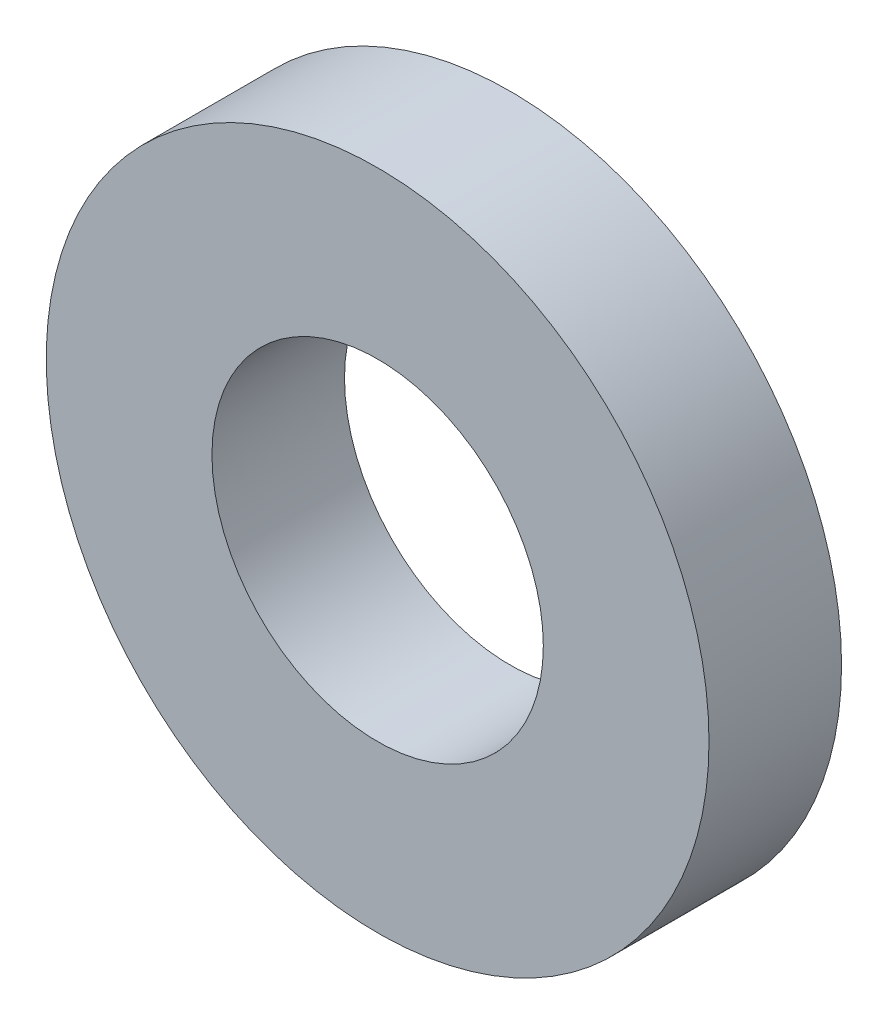
ISO-10303-21;
HEADER;
FILE_DESCRIPTION(('STEP AP214'),'2;1');
FILE_NAME('part.step','',(''),(''),'','','');
FILE_SCHEMA(('AUTOMOTIVE_DESIGN { 1 0 10303 214 1 1 1 1 }'));
ENDSEC;
DATA;
#1=APPLICATION_CONTEXT('core data for automotive mechanical design processes');
#2=APPLICATION_PROTOCOL_DEFINITION('international standard','automotive_design',2000,#1);
#3=PRODUCT_CONTEXT('',#1,'mechanical');
#4=PRODUCT('Part','Part','',(#3));
#5=PRODUCT_RELATED_PRODUCT_CATEGORY('part','',(#4));
#6=PRODUCT_DEFINITION_FORMATION('','',#4);
#7=PRODUCT_DEFINITION_CONTEXT('part definition',#1,'design');
#8=PRODUCT_DEFINITION('design','',#6,#7);
#9=PRODUCT_DEFINITION_SHAPE('','',#8);
#10=(LENGTH_UNIT() NAMED_UNIT(*) SI_UNIT(.MILLI.,.METRE.));
#11=(NAMED_UNIT(*) PLANE_ANGLE_UNIT() SI_UNIT($,.RADIAN.));
#12=(NAMED_UNIT(*) SI_UNIT($,.STERADIAN.) SOLID_ANGLE_UNIT());
#13=UNCERTAINTY_MEASURE_WITH_UNIT(LENGTH_MEASURE(1.E-05),#10,'distance_accuracy_value','');
#14=(GEOMETRIC_REPRESENTATION_CONTEXT(3) GLOBAL_UNCERTAINTY_ASSIGNED_CONTEXT((#13)) GLOBAL_UNIT_ASSIGNED_CONTEXT((#10,
#11,#12)) REPRESENTATION_CONTEXT('',''));
#15=CARTESIAN_POINT('',(0.,0.,0.));
#16=DIRECTION('',(0.,0.,1.));
#17=DIRECTION('',(1.,0.,0.));
#18=AXIS2_PLACEMENT_3D('',#15,#16,#17);
#19=CARTESIAN_POINT('',(0.,0.,0.5));
#20=DIRECTION('',(0.,0.,1.));
#21=DIRECTION('',(1.,0.,0.));
#22=AXIS2_PLACEMENT_3D('',#19,#20,#21);
#23=PLANE('',#22);
#24=CARTESIAN_POINT('',(0.,0.,0.5));
#25=DIRECTION('',(0.,0.,1.));
#26=DIRECTION('',(1.,0.,0.));
#27=AXIS2_PLACEMENT_3D('',#24,#25,#26);
#28=CIRCLE('',#27,2.5);
#29=CARTESIAN_POINT('',(2.5,0.,0.5));
#30=VERTEX_POINT('',#29);
#31=EDGE_CURVE('E10',#30,#30,#28,.T.);
#32=ORIENTED_EDGE('',*,*,#31,.T.);
#33=EDGE_LOOP('',(#32));
#34=FACE_BOUND('',#33,.T.);
#35=CARTESIAN_POINT('',(0.,0.,0.5));
#36=DIRECTION('',(0.,0.,1.));
#37=DIRECTION('',(1.,0.,0.));
#38=AXIS2_PLACEMENT_3D('',#35,#36,#37);
#39=CIRCLE('',#38,1.25);
#40=CARTESIAN_POINT('',(1.25,0.,0.5));
#41=VERTEX_POINT('',#40);
#42=EDGE_CURVE('E54',#41,#41,#39,.T.);
#43=ORIENTED_EDGE('',*,*,#42,.F.);
#44=EDGE_LOOP('',(#43));
#45=FACE_BOUND('',#44,.T.);
#46=ADVANCED_FACE('F41',(#34,#45),#23,.T.);
#47=CARTESIAN_POINT('',(0.,0.,-0.5));
#48=DIRECTION('',(0.,0.,1.));
#49=DIRECTION('',(1.,0.,0.));
#50=AXIS2_PLACEMENT_3D('',#47,#48,#49);
#51=PLANE('',#50);
#52=CARTESIAN_POINT('',(0.,0.,-0.5));
#53=DIRECTION('',(0.,0.,1.));
#54=DIRECTION('',(1.,0.,0.));
#55=AXIS2_PLACEMENT_3D('',#52,#53,#54);
#56=CIRCLE('',#55,2.5);
#57=CARTESIAN_POINT('',(2.5,0.,-0.5));
#58=VERTEX_POINT('',#57);
#59=EDGE_CURVE('E45',#58,#58,#56,.T.);
#60=ORIENTED_EDGE('',*,*,#59,.F.);
#61=EDGE_LOOP('',(#60));
#62=FACE_BOUND('',#61,.T.);
#63=CARTESIAN_POINT('',(0.,0.,-0.5));
#64=DIRECTION('',(0.,0.,1.));
#65=DIRECTION('',(1.,0.,0.));
#66=AXIS2_PLACEMENT_3D('',#63,#64,#65);
#67=CIRCLE('',#66,1.25);
#68=CARTESIAN_POINT('',(1.25,0.,-0.5));
#69=VERTEX_POINT('',#68);
#70=EDGE_CURVE('E56',#69,#69,#67,.T.);
#71=ORIENTED_EDGE('',*,*,#70,.T.);
#72=EDGE_LOOP('',(#71));
#73=FACE_BOUND('',#72,.T.);
#74=ADVANCED_FACE('F68',(#62,#73),#51,.F.);
#75=CARTESIAN_POINT('',(0.,0.,0.5));
#76=DIRECTION('',(0.,0.,-1.));
#77=DIRECTION('',(-1.,0.,0.));
#78=AXIS2_PLACEMENT_3D('',#75,#76,#77);
#79=CYLINDRICAL_SURFACE('',#78,2.5);
#80=ORIENTED_EDGE('',*,*,#31,.F.);
#81=EDGE_LOOP('',(#80));
#82=FACE_BOUND('',#81,.T.);
#83=ORIENTED_EDGE('',*,*,#59,.T.);
#84=EDGE_LOOP('',(#83));
#85=FACE_BOUND('',#84,.T.);
#86=ADVANCED_FACE('F43',(#82,#85),#79,.T.);
#87=CARTESIAN_POINT('',(0.,0.,0.5));
#88=DIRECTION('',(0.,0.,-1.));
#89=DIRECTION('',(-1.,0.,0.));
#90=AXIS2_PLACEMENT_3D('',#87,#88,#89);
#91=CYLINDRICAL_SURFACE('',#90,1.25);
#92=ORIENTED_EDGE('',*,*,#42,.T.);
#93=EDGE_LOOP('',(#92));
#94=FACE_BOUND('',#93,.T.);
#95=ORIENTED_EDGE('',*,*,#70,.F.);
#96=EDGE_LOOP('',(#95));
#97=FACE_BOUND('',#96,.T.);
#98=ADVANCED_FACE('F64',(#94,#97),#91,.F.);
#99=CLOSED_SHELL('',(#46,#74,#86,#98));
#100=MANIFOLD_SOLID_BREP('B2',#99);
#101=ADVANCED_BREP_SHAPE_REPRESENTATION('',(#18,#100),#14);
#102=SHAPE_DEFINITION_REPRESENTATION(#9,#101);
ENDSEC;
END-ISO-10303-21;
